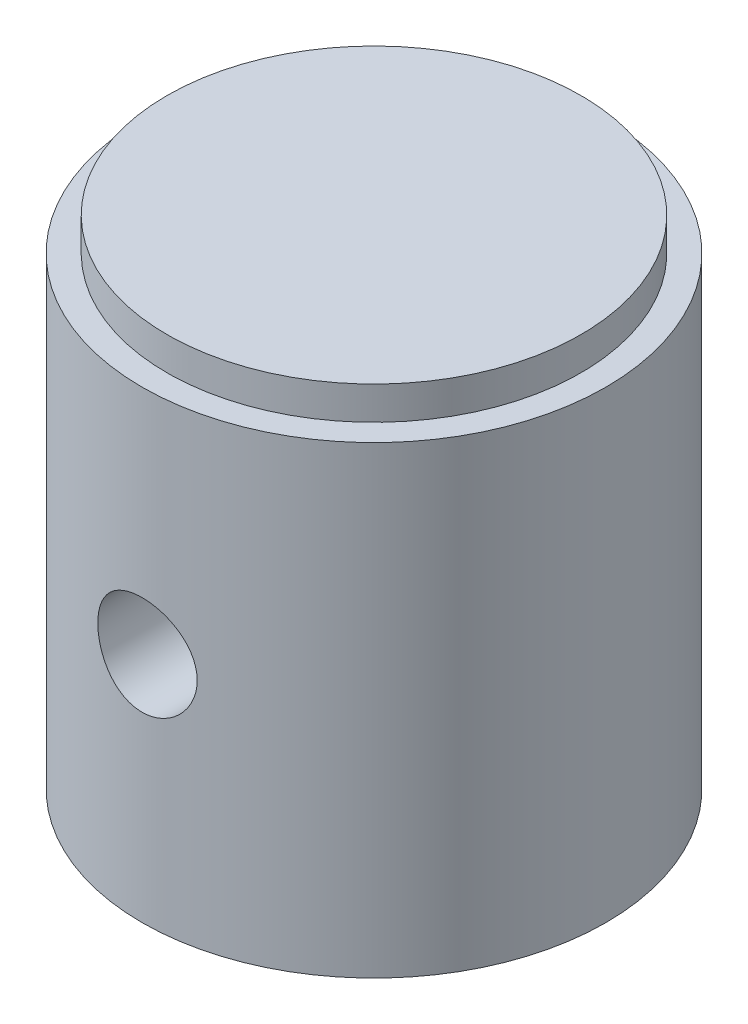
ISO-10303-21;
HEADER;
FILE_DESCRIPTION(('STEP AP214'),'2;1');
FILE_NAME('part.step','',(''),(''),'','','');
FILE_SCHEMA(('AUTOMOTIVE_DESIGN { 1 0 10303 214 1 1 1 1 }'));
ENDSEC;
DATA;
#1=APPLICATION_CONTEXT('core data for automotive mechanical design processes');
#2=APPLICATION_PROTOCOL_DEFINITION('international standard','automotive_design',2000,#1);
#3=PRODUCT_CONTEXT('',#1,'mechanical');
#4=PRODUCT('Part','Part','',(#3));
#5=PRODUCT_RELATED_PRODUCT_CATEGORY('part','',(#4));
#6=PRODUCT_DEFINITION_FORMATION('','',#4);
#7=PRODUCT_DEFINITION_CONTEXT('part definition',#1,'design');
#8=PRODUCT_DEFINITION('design','',#6,#7);
#9=PRODUCT_DEFINITION_SHAPE('','',#8);
#10=(LENGTH_UNIT() NAMED_UNIT(*) SI_UNIT(.MILLI.,.METRE.));
#11=(NAMED_UNIT(*) PLANE_ANGLE_UNIT() SI_UNIT($,.RADIAN.));
#12=(NAMED_UNIT(*) SI_UNIT($,.STERADIAN.) SOLID_ANGLE_UNIT());
#13=UNCERTAINTY_MEASURE_WITH_UNIT(LENGTH_MEASURE(1.E-05),#10,'distance_accuracy_value','');
#14=(GEOMETRIC_REPRESENTATION_CONTEXT(3) GLOBAL_UNCERTAINTY_ASSIGNED_CONTEXT((#13)) GLOBAL_UNIT_ASSIGNED_CONTEXT((#10,
#11,#12)) REPRESENTATION_CONTEXT('',''));
#15=CARTESIAN_POINT('',(0.,0.,0.));
#16=DIRECTION('',(0.,0.,1.));
#17=DIRECTION('',(1.,0.,0.));
#18=AXIS2_PLACEMENT_3D('',#15,#16,#17);
#19=CARTESIAN_POINT('',(0.,1.1459120596191,0.));
#20=DIRECTION('',(0.,1.,0.));
#21=DIRECTION('',(-1.,0.,0.));
#22=AXIS2_PLACEMENT_3D('',#19,#20,#21);
#23=PLANE('',#22);
#24=CARTESIAN_POINT('',(0.,1.1459120596191,0.));
#25=DIRECTION('',(0.,1.,0.));
#26=DIRECTION('',(-1.,0.,0.));
#27=AXIS2_PLACEMENT_3D('',#24,#25,#26);
#28=CIRCLE('',#27,6.25);
#29=CARTESIAN_POINT('',(-6.25,1.1459120596191,0.));
#30=VERTEX_POINT('',#29);
#31=EDGE_CURVE('E11',#30,#30,#28,.T.);
#32=ORIENTED_EDGE('',*,*,#31,.T.);
#33=EDGE_LOOP('',(#32));
#34=FACE_BOUND('',#33,.T.);
#35=ADVANCED_FACE('F39',(#34),#23,.T.);
#36=CARTESIAN_POINT('',(0.,1.1459120596191,0.));
#37=DIRECTION('',(0.,1.,0.));
#38=DIRECTION('',(-1.,0.,0.));
#39=AXIS2_PLACEMENT_3D('',#36,#37,#38);
#40=CYLINDRICAL_SURFACE('',#39,6.25);
#41=CARTESIAN_POINT('',(0.,0.145912059619102,0.));
#42=DIRECTION('',(0.,1.,0.));
#43=DIRECTION('',(-1.,0.,0.));
#44=AXIS2_PLACEMENT_3D('',#41,#42,#43);
#45=CIRCLE('',#44,6.25);
#46=CARTESIAN_POINT('',(-6.25,0.145912059619103,0.));
#47=VERTEX_POINT('',#46);
#48=EDGE_CURVE('E52',#47,#47,#45,.T.);
#49=ORIENTED_EDGE('',*,*,#48,.T.);
#50=EDGE_LOOP('',(#49));
#51=FACE_BOUND('',#50,.T.);
#52=ORIENTED_EDGE('',*,*,#31,.F.);
#53=EDGE_LOOP('',(#52));
#54=FACE_BOUND('',#53,.T.);
#55=ADVANCED_FACE('F127',(#51,#54),#40,.T.);
#56=CARTESIAN_POINT('',(-6.25,0.145912059619103,0.));
#57=DIRECTION('',(0.,1.,0.));
#58=DIRECTION('',(-1.,0.,0.));
#59=AXIS2_PLACEMENT_3D('',#56,#57,#58);
#60=PLANE('',#59);
#61=CARTESIAN_POINT('',(0.,0.145912059619102,0.));
#62=DIRECTION('',(0.,1.,0.));
#63=DIRECTION('',(-1.,0.,0.));
#64=AXIS2_PLACEMENT_3D('',#61,#62,#63);
#65=CIRCLE('',#64,7.);
#66=CARTESIAN_POINT('',(-7.,0.145912059619103,0.));
#67=VERTEX_POINT('',#66);
#68=EDGE_CURVE('E91',#67,#67,#65,.T.);
#69=ORIENTED_EDGE('',*,*,#68,.T.);
#70=EDGE_LOOP('',(#69));
#71=FACE_BOUND('',#70,.T.);
#72=ORIENTED_EDGE('',*,*,#48,.F.);
#73=EDGE_LOOP('',(#72));
#74=FACE_BOUND('',#73,.T.);
#75=ADVANCED_FACE('F123',(#71,#74),#60,.T.);
#76=CARTESIAN_POINT('',(0.,1.1459120596191,0.));
#77=DIRECTION('',(0.,1.,0.));
#78=DIRECTION('',(-1.,0.,0.));
#79=AXIS2_PLACEMENT_3D('',#76,#77,#78);
#80=CYLINDRICAL_SURFACE('',#79,7.);
#81=CARTESIAN_POINT('',(0.,-5.35408794038089,-7.));
#82=CARTESIAN_POINT('',(0.083235886090617,-5.3540908399552,-6.99999846043226));
#83=CARTESIAN_POINT('',(0.166507195600275,-5.36103954876875,-6.9985002594971));
#84=CARTESIAN_POINT('',(0.330687344293328,-5.38862359723449,-6.99266829827727));
#85=CARTESIAN_POINT('',(0.411594403571191,-5.40926898457583,-6.98833245637099));
#86=CARTESIAN_POINT('',(0.568649323817737,-5.46357230498893,-6.97730831788826));
#87=CARTESIAN_POINT('',(0.644801963446556,-5.49721691976221,-6.97062242967171));
#88=CARTESIAN_POINT('',(0.790378177960787,-5.57652202655216,-6.95562106817971));
#89=CARTESIAN_POINT('',(0.85980198174737,-5.62218210963084,-6.9473056503666));
#90=CARTESIAN_POINT('',(0.99102479053523,-5.7249682400544,-6.92981369246311));
#91=CARTESIAN_POINT('',(1.05270503419445,-5.78224416227942,-6.92062683143259));
#92=CARTESIAN_POINT('',(1.16566042389435,-5.90631425606609,-6.90250069814144));
#93=CARTESIAN_POINT('',(1.21693467150908,-5.97310924863215,-6.8935614473163));
#94=CARTESIAN_POINT('',(1.30814204379809,-6.11519369324133,-6.87684116047225));
#95=CARTESIAN_POINT('',(1.34794958335009,-6.19056545813711,-6.8690733634436));
#96=CARTESIAN_POINT('',(1.41428823691148,-6.34712239414773,-6.85572325558537));
#97=CARTESIAN_POINT('',(1.44082087001716,-6.42830689887347,-6.85014069470711));
#98=CARTESIAN_POINT('',(1.47946574422454,-6.59289902696897,-6.8418980892631));
#99=CARTESIAN_POINT('',(1.49178779748342,-6.67625521604476,-6.83919556896486));
#100=CARTESIAN_POINT('',(1.50231395206577,-6.84389217288789,-6.83689139845106));
#101=CARTESIAN_POINT('',(1.50051971664629,-6.92817283056084,-6.83728938291729));
#102=CARTESIAN_POINT('',(1.48303326340861,-7.09371262831469,-6.84110276603832));
#103=CARTESIAN_POINT('',(1.46758398649408,-7.17499882948105,-6.84446541682162));
#104=CARTESIAN_POINT('',(1.42361054298677,-7.33379818067024,-6.85374593375788));
#105=CARTESIAN_POINT('',(1.39508566936466,-7.41131112641322,-6.85966393808402));
#106=CARTESIAN_POINT('',(1.32554551075991,-7.56105081325423,-6.87344080755724));
#107=CARTESIAN_POINT('',(1.2844361097283,-7.63323245309345,-6.88131420983365));
#108=CARTESIAN_POINT('',(1.19096007283993,-7.76976310533885,-6.89810572501288));
#109=CARTESIAN_POINT('',(1.13859196103562,-7.8341110890671,-6.90702397481896));
#110=CARTESIAN_POINT('',(1.0227954275532,-7.95454729605429,-6.92512718393878));
#111=CARTESIAN_POINT('',(0.959160233964409,-8.01043664696564,-6.93431383972178));
#112=CARTESIAN_POINT('',(0.823317306269096,-8.11078167407056,-6.95175017497059));
#113=CARTESIAN_POINT('',(0.751109428775399,-8.15523715898129,-6.95999983875972));
#114=CARTESIAN_POINT('',(0.599933462049959,-8.23149862028782,-6.97465778534003));
#115=CARTESIAN_POINT('',(0.520952258863482,-8.26327935295888,-6.98106238643354));
#116=CARTESIAN_POINT('',(0.358603146685706,-8.31306358870198,-6.99128109245334));
#117=CARTESIAN_POINT('',(0.275235851133668,-8.33106901294421,-6.99509555860384));
#118=CARTESIAN_POINT('',(0.108187670836628,-8.35250415452432,-6.99965306347808));
#119=CARTESIAN_POINT('',(0.0245431772716141,-8.35620565326268,-7.00045336521066));
#120=CARTESIAN_POINT('',(-0.142168973650405,-8.34966336925573,-6.99905248935969));
#121=CARTESIAN_POINT('',(-0.225236668127255,-8.33942049241795,-6.99685150675698));
#122=CARTESIAN_POINT('',(-0.387542537982806,-8.30550569671919,-6.98973143045266));
#123=CARTESIAN_POINT('',(-0.466811712908477,-8.28197557090836,-6.98484105045459));
#124=CARTESIAN_POINT('',(-0.620278450473418,-8.22231099738607,-6.9728892442151));
#125=CARTESIAN_POINT('',(-0.69447559258774,-8.18617550606924,-6.96582763822237));
#126=CARTESIAN_POINT('',(-0.836821397964754,-8.10175439732057,-6.950175043904));
#127=CARTESIAN_POINT('',(-0.90487257511114,-8.05330814547117,-6.94156431354275));
#128=CARTESIAN_POINT('',(-1.0319769255236,-7.94585311549216,-6.92381033034847));
#129=CARTESIAN_POINT('',(-1.091028978692,-7.88684302449345,-6.91466701142097));
#130=CARTESIAN_POINT('',(-1.19952711057989,-7.75869057019376,-6.89668172706324));
#131=CARTESIAN_POINT('',(-1.24878537255156,-7.68938784115879,-6.88784792221285));
#132=CARTESIAN_POINT('',(-1.3349641538604,-7.5433333439029,-6.87166654559681));
#133=CARTESIAN_POINT('',(-1.37188519913706,-7.4665818934034,-6.86431891048055));
#134=CARTESIAN_POINT('',(-1.43209741248548,-7.30821564138629,-6.8520100980739));
#135=CARTESIAN_POINT('',(-1.45546398641275,-7.22663058395023,-6.84703574582967));
#136=CARTESIAN_POINT('',(-1.48812696085335,-7.06057235654726,-6.84001186708418));
#137=CARTESIAN_POINT('',(-1.49742550780258,-6.97609962917957,-6.83796189439706));
#138=CARTESIAN_POINT('',(-1.5015999992604,-6.80855559720565,-6.83704618848155));
#139=CARTESIAN_POINT('',(-1.49677347258311,-6.72549192540032,-6.83811476518543));
#140=CARTESIAN_POINT('',(-1.47349789406331,-6.56139069824831,-6.8431676318483));
#141=CARTESIAN_POINT('',(-1.45504898957979,-6.48035312099432,-6.84715189026714));
#142=CARTESIAN_POINT('',(-1.40519345940434,-6.32282928251173,-6.85755581104157));
#143=CARTESIAN_POINT('',(-1.37382847170887,-6.2463292917166,-6.86396764224703));
#144=CARTESIAN_POINT('',(-1.29906751595601,-6.09963256787405,-6.87850764590649));
#145=CARTESIAN_POINT('',(-1.255670353015,-6.02943646176585,-6.88663598880363));
#146=CARTESIAN_POINT('',(-1.15708290349304,-5.89586974665553,-6.90389055593232));
#147=CARTESIAN_POINT('',(-1.10167987421237,-5.83265824443392,-6.91303309938926));
#148=CARTESIAN_POINT('',(-0.98108655461962,-5.71633167786044,-6.93117449799694));
#149=CARTESIAN_POINT('',(-0.915894009385597,-5.66321894606869,-6.94017331951296));
#150=CARTESIAN_POINT('',(-0.776603147268716,-5.56797198087533,-6.95714491048987));
#151=CARTESIAN_POINT('',(-0.702404846009641,-5.52598133414992,-6.96510364570626));
#152=CARTESIAN_POINT('',(-0.547850160940597,-5.45513341147471,-6.97895826104019));
#153=CARTESIAN_POINT('',(-0.467499105863879,-5.42626491779586,-6.98485590212343));
#154=CARTESIAN_POINT('',(-0.322535217553204,-5.38773575524975,-6.99284848461772));
#155=CARTESIAN_POINT('',(-0.258717205545979,-5.37514150640086,-6.99551391888263));
#156=CARTESIAN_POINT('',(-0.129939960853847,-5.35831663866923,-6.99909024154719));
#157=CARTESIAN_POINT('',(-0.0649807750887449,-5.35408567673484,-7.00000120191314));
#158=CARTESIAN_POINT('',(0.,-5.35408794038089,-7.));
#159=B_SPLINE_CURVE_WITH_KNOTS('',3,(#81,#82,#83,#84,#85,#86,#87,#88,#89,#90,#91,#92,#93,#94,
#95,#96,#97,#98,#99,#100,#101,#102,#103,#104,#105,#106,#107,#108,#109,#110,#111,#112,#113,#114,
#115,#116,#117,#118,#119,#120,#121,#122,#123,#124,#125,#126,#127,#128,#129,#130,#131,#132,#133,
#134,#135,#136,#137,#138,#139,#140,#141,#142,#143,#144,#145,#146,#147,#148,#149,#150,#151,#152,
#153,#154,#155,#156,#157,#158),.UNSPECIFIED.,.T.,.F.,(4,2,2,2,2,2,2,2,2,2,2,2,2,2,2,2,2,2,2,2,2,
2,2,2,2,2,2,2,2,2,2,2,2,2,2,2,2,2,4),(0.,0.249469836512082,0.499122883219936,0.748520824425602,
0.997910278645886,1.25074961881732,1.50361077918506,1.7591442921451,2.0146485567749,
2.26633008124666,2.51798195169165,2.76524475452927,3.01252092904568,3.26169356165968,
3.51089887920889,3.76527011050291,4.0196455970235,4.27452521139806,4.52936927256343,
4.77934665704185,5.02930780231429,5.27665060589267,5.52401389198434,5.77478733867803,
6.02559197304485,6.28082063283534,6.53603841075806,6.78982240408475,7.04356767229185,
7.29200680540294,7.5404432510827,7.78808499706785,8.03575134451623,8.28822950154114,
8.54076590397115,8.79641910357222,9.05185334010271,9.24661799132293,9.44137465337336),.UNSPECIFIED.);
#160=CARTESIAN_POINT('',(0.,-5.35408794038089,-7.));
#161=VERTEX_POINT('',#160);
#162=EDGE_CURVE('E68',#161,#161,#159,.T.);
#163=ORIENTED_EDGE('',*,*,#162,.F.);
#164=EDGE_LOOP('',(#163));
#165=FACE_BOUND('',#164,.T.);
#166=CARTESIAN_POINT('',(1.5,-6.8540879403809,6.83739716558867));
#167=CARTESIAN_POINT('',(1.49999708238613,-6.77087678789895,6.83739884558951));
#168=CARTESIAN_POINT('',(1.49305236244768,-6.68763016643878,6.83893272341929));
#169=CARTESIAN_POINT('',(1.46548559252999,-6.52350126813889,6.84489178429867));
#170=CARTESIAN_POINT('',(1.44485339653622,-6.44262079170469,6.84931911211841));
#171=CARTESIAN_POINT('',(1.39058863684599,-6.28562219080669,6.86054115293409));
#172=CARTESIAN_POINT('',(1.35697000991314,-6.20949906225943,6.86733332725825));
#173=CARTESIAN_POINT('',(1.27772617673341,-6.06397266643629,6.88251670848644));
#174=CARTESIAN_POINT('',(1.23210132048776,-5.99456920335182,6.89090786877545));
#175=CARTESIAN_POINT('',(1.12935142570221,-5.86332497889877,6.90849578796654));
#176=CARTESIAN_POINT('',(1.07206859483983,-5.80160906414093,6.91770249871753));
#177=CARTESIAN_POINT('',(0.947969508129576,-5.68858438597511,6.93579691710397));
#178=CARTESIAN_POINT('',(0.881152530217675,-5.63727641152083,6.94468460051416));
#179=CARTESIAN_POINT('',(0.739047288464581,-5.54603249588946,6.96124769109432));
#180=CARTESIAN_POINT('',(0.663680488229952,-5.50621628461028,6.96890998819429));
#181=CARTESIAN_POINT('',(0.507134269342594,-5.4398602489346,6.98204671042934));
#182=CARTESIAN_POINT('',(0.425955477380311,-5.41331899559462,6.98752137103329));
#183=CARTESIAN_POINT('',(0.261387187671511,-5.37465796944956,6.9955956528118));
#184=CARTESIAN_POINT('',(0.178049400596923,-5.36232701182847,6.99823733378385));
#185=CARTESIAN_POINT('',(0.010448945306644,-5.35177666306764,7.00049362207002));
#186=CARTESIAN_POINT('',(-0.0738136201647599,-5.35355571982014,7.00010856232698));
#187=CARTESIAN_POINT('',(-0.239417029250512,-5.37101690504448,6.99638700862558));
#188=CARTESIAN_POINT('',(-0.320783115362113,-5.38647144067082,6.99309883152431));
#189=CARTESIAN_POINT('',(-0.479739463978389,-5.43048262223276,6.98399541589104));
#190=CARTESIAN_POINT('',(-0.557329560175055,-5.45903984468064,6.97818006616518));
#191=CARTESIAN_POINT('',(-0.707167497556553,-5.52864939926942,6.96459754646858));
#192=CARTESIAN_POINT('',(-0.779373657015789,-5.56978870758524,6.95681685803946));
#193=CARTESIAN_POINT('',(-0.915940926562847,-5.66332990854449,6.94015793743865));
#194=CARTESIAN_POINT('',(-0.980301006451529,-5.7157332776812,6.93127956144693));
#195=CARTESIAN_POINT('',(-1.10070208800198,-5.83155648490876,6.91319326460925));
#196=CARTESIAN_POINT('',(-1.15655117320251,-5.89517551973793,6.90398230372853));
#197=CARTESIAN_POINT('',(-1.25682243234728,-6.0309712254494,6.88643566831974));
#198=CARTESIAN_POINT('',(-1.30124432118068,-6.10314810978615,6.87810001563386));
#199=CARTESIAN_POINT('',(-1.37748077573296,-6.25431244144466,6.86324023586723));
#200=CARTESIAN_POINT('',(-1.40926035088923,-6.33331806423334,6.85672115127775));
#201=CARTESIAN_POINT('',(-1.45903495159116,-6.49572070632733,6.84630340806616));
#202=CARTESIAN_POINT('',(-1.47703206694628,-6.57911705782409,6.84240435218483));
#203=CARTESIAN_POINT('',(-1.49843586024652,-6.74618369303061,6.83774881255446));
#204=CARTESIAN_POINT('',(-1.5021214192864,-6.8298166154582,6.83693227051701));
#205=CARTESIAN_POINT('',(-1.49555139642373,-6.99650193356259,6.83837239573993));
#206=CARTESIAN_POINT('',(-1.48529673081635,-7.07955436703445,6.84062886101063));
#207=CARTESIAN_POINT('',(-1.45137894635584,-7.24175837536166,6.84790415484205));
#208=CARTESIAN_POINT('',(-1.42786830251553,-7.32094337297786,6.85289155274364));
#209=CARTESIAN_POINT('',(-1.36827052946749,-7.47425027791382,6.86503859869777));
#210=CARTESIAN_POINT('',(-1.33218223662818,-7.54837171601509,6.87219844772849));
#211=CARTESIAN_POINT('',(-1.24783504416705,-7.69065762513981,6.88801634080345));
#212=CARTESIAN_POINT('',(-1.19940368590792,-7.75871752239308,6.89669501746317));
#213=CARTESIAN_POINT('',(-1.09197183833601,-7.88584628625469,6.91451775360139));
#214=CARTESIAN_POINT('',(-1.03297009182161,-7.94491408182936,6.92366186834461));
#215=CARTESIAN_POINT('',(-0.904812764420814,-8.05345824332565,6.94158239990173));
#216=CARTESIAN_POINT('',(-0.835494925828771,-8.10274485653791,6.95034935607746));
#217=CARTESIAN_POINT('',(-0.689401481282276,-8.18897334973194,6.96635610714901));
#218=CARTESIAN_POINT('',(-0.61262621604374,-8.22591579335373,6.97359597176692));
#219=CARTESIAN_POINT('',(-0.454265418982041,-8.28613999501937,6.98569278381574));
#220=CARTESIAN_POINT('',(-0.372713193075172,-8.30950624412717,6.99056443803698));
#221=CARTESIAN_POINT('',(-0.206725177003289,-8.34217964611321,6.9974393930198));
#222=CARTESIAN_POINT('',(-0.122289789973993,-8.35148875635481,6.99944309312296));
#223=CARTESIAN_POINT('',(0.045263717052829,-8.35569859279275,7.00034511009056));
#224=CARTESIAN_POINT('',(0.128374505509229,-8.35088309898552,6.99930459001667));
#225=CARTESIAN_POINT('',(0.29257293841596,-8.32761317686187,6.99436552363383));
#226=CARTESIAN_POINT('',(0.373660616405285,-8.30915897480258,6.99046702473686));
#227=CARTESIAN_POINT('',(0.53130194848727,-8.2592691341314,6.98025388638537));
#228=CARTESIAN_POINT('',(0.607868365073177,-8.22787225099534,6.97394646430492));
#229=CARTESIAN_POINT('',(0.75468495672322,-8.15302666921177,6.9595903605066));
#230=CARTESIAN_POINT('',(0.824934544796141,-8.10957685207487,6.9515415172034));
#231=CARTESIAN_POINT('',(0.958512306895243,-8.01092562163822,6.93439809934493));
#232=CARTESIAN_POINT('',(1.02169036510577,-7.95552378205958,6.92528708907874));
#233=CARTESIAN_POINT('',(1.13795001457643,-7.83494733013055,6.90713690075836));
#234=CARTESIAN_POINT('',(1.19102918062422,-7.76977037702529,6.89809774045682));
#235=CARTESIAN_POINT('',(1.28623261596675,-7.63049744719522,6.88098693651915));
#236=CARTESIAN_POINT('',(1.32820897809616,-7.55629858209387,6.87292905956533));
#237=CARTESIAN_POINT('',(1.39903004659825,-7.40174421945765,6.85886497228049));
#238=CARTESIAN_POINT('',(1.42788606423931,-7.32139409512783,6.85285699581573));
#239=CARTESIAN_POINT('',(1.46638607121557,-7.17646180919503,6.84470560641996));
#240=CARTESIAN_POINT('',(1.47896752507743,-7.11267626467307,6.84198283087953));
#241=CARTESIAN_POINT('',(1.49577544043437,-6.98396362880358,6.83832799504406));
#242=CARTESIAN_POINT('',(1.50000227727981,-6.91903658887258,6.83739585430069));
#243=CARTESIAN_POINT('',(1.5,-6.8540879403809,6.83739716558867));
#244=B_SPLINE_CURVE_WITH_KNOTS('',3,(#166,#167,#168,#169,#170,#171,#172,#173,#174,#175,#176,
#177,#178,#179,#180,#181,#182,#183,#184,#185,#186,#187,#188,#189,#190,#191,#192,#193,#194,#195,
#196,#197,#198,#199,#200,#201,#202,#203,#204,#205,#206,#207,#208,#209,#210,#211,#212,#213,#214,
#215,#216,#217,#218,#219,#220,#221,#222,#223,#224,#225,#226,#227,#228,#229,#230,#231,#232,#233,
#234,#235,#236,#237,#238,#239,#240,#241,#242,#243),.UNSPECIFIED.,.T.,.F.,(4,2,2,2,2,2,2,2,2,2,2,
2,2,2,2,2,2,2,2,2,2,2,2,2,2,2,2,2,2,2,2,2,2,2,2,2,2,2,4),(0.,0.249395482027528,
0.498976038479964,0.748289491152759,0.997595676735283,1.25053229582692,1.50348808112879,
1.75899134820278,2.01446710646268,2.26609508151929,2.51769537777241,2.76518557667372,
3.01268666607584,3.26193888143437,3.51122378872315,3.76548960779295,4.01976177023092,
4.27473287411781,4.52966530953839,4.77960433192523,5.02952692653917,5.27663180749375,
5.5237595556315,5.77455010216318,6.02537049659078,6.2806621468321,6.53594213875541,
6.78961589824375,7.04325433208539,7.29183199644127,7.540405537151,7.78824009619483,
8.03609766151365,8.28848914160965,8.54094115631232,8.79660380167249,9.05204561611687,
9.24671456122272,9.44137476018022),.UNSPECIFIED.);
#245=CARTESIAN_POINT('',(1.5,-6.8540879403809,6.83739716558867));
#246=VERTEX_POINT('',#245);
#247=EDGE_CURVE('E76',#246,#246,#244,.T.);
#248=ORIENTED_EDGE('',*,*,#247,.F.);
#249=EDGE_LOOP('',(#248));
#250=FACE_BOUND('',#249,.T.);
#251=CARTESIAN_POINT('',(0.,-13.8540879403809,0.));
#252=DIRECTION('',(0.,1.,0.));
#253=DIRECTION('',(-1.,0.,0.));
#254=AXIS2_PLACEMENT_3D('',#251,#252,#253);
#255=CIRCLE('',#254,7.);
#256=CARTESIAN_POINT('',(-7.,-13.8540879403809,0.));
#257=VERTEX_POINT('',#256);
#258=EDGE_CURVE('E87',#257,#257,#255,.T.);
#259=ORIENTED_EDGE('',*,*,#258,.T.);
#260=EDGE_LOOP('',(#259));
#261=FACE_BOUND('',#260,.T.);
#262=ORIENTED_EDGE('',*,*,#68,.F.);
#263=EDGE_LOOP('',(#262));
#264=FACE_BOUND('',#263,.T.);
#265=ADVANCED_FACE('F117',(#165,#250,#261,#264),#80,.T.);
#266=CARTESIAN_POINT('',(-7.,-13.8540879403809,0.));
#267=DIRECTION('',(0.,-1.,0.));
#268=DIRECTION('',(1.,0.,0.));
#269=AXIS2_PLACEMENT_3D('',#266,#267,#268);
#270=PLANE('',#269);
#271=CARTESIAN_POINT('',(0.,-13.8540879403809,0.));
#272=DIRECTION('',(0.,1.,0.));
#273=DIRECTION('',(-1.,0.,0.));
#274=AXIS2_PLACEMENT_3D('',#271,#272,#273);
#275=CIRCLE('',#274,6.25);
#276=CARTESIAN_POINT('',(-6.25,-13.8540879403809,0.));
#277=VERTEX_POINT('',#276);
#278=EDGE_CURVE('E73',#277,#277,#275,.T.);
#279=ORIENTED_EDGE('',*,*,#278,.T.);
#280=EDGE_LOOP('',(#279));
#281=FACE_BOUND('',#280,.T.);
#282=ORIENTED_EDGE('',*,*,#258,.F.);
#283=EDGE_LOOP('',(#282));
#284=FACE_BOUND('',#283,.T.);
#285=ADVANCED_FACE('F122',(#281,#284),#270,.T.);
#286=CARTESIAN_POINT('',(0.,-13.8540879403809,0.));
#287=DIRECTION('',(0.,-1.,0.));
#288=DIRECTION('',(1.,0.,0.));
#289=AXIS2_PLACEMENT_3D('',#286,#287,#288);
#290=CONICAL_SURFACE('',#289,6.25,0.349065850398867);
#291=CARTESIAN_POINT('',(0.,-9.73287181119897,0.));
#292=DIRECTION('',(0.,1.,0.));
#293=DIRECTION('',(-1.,0.,0.));
#294=AXIS2_PLACEMENT_3D('',#291,#292,#293);
#295=CIRCLE('',#294,4.75);
#296=CARTESIAN_POINT('',(-4.75,-9.73287181119897,0.));
#297=VERTEX_POINT('',#296);
#298=EDGE_CURVE('E67',#297,#297,#295,.T.);
#299=ORIENTED_EDGE('',*,*,#298,.T.);
#300=EDGE_LOOP('',(#299));
#301=FACE_BOUND('',#300,.T.);
#302=ORIENTED_EDGE('',*,*,#278,.F.);
#303=EDGE_LOOP('',(#302));
#304=FACE_BOUND('',#303,.T.);
#305=ADVANCED_FACE('F161',(#301,#304),#290,.F.);
#306=CARTESIAN_POINT('',(0.,1.1459120596191,0.));
#307=DIRECTION('',(0.,1.,0.));
#308=DIRECTION('',(-1.,0.,0.));
#309=AXIS2_PLACEMENT_3D('',#306,#307,#308);
#310=CYLINDRICAL_SURFACE('',#309,4.75);
#311=CARTESIAN_POINT('',(1.5,-6.8540879403809,-4.50693909432998));
#312=CARTESIAN_POINT('',(1.49999958004515,-6.77211965770475,-4.50693949515468));
#313=CARTESIAN_POINT('',(1.49325840231682,-6.69014695665615,-4.50919970874085));
#314=CARTESIAN_POINT('',(1.46655104887094,-6.52861293088145,-4.5179553253781));
#315=CARTESIAN_POINT('',(1.44658152131253,-6.44905222265821,-4.52445180182027));
#316=CARTESIAN_POINT('',(1.39417508352591,-6.29470573753136,-4.54087234787262));
#317=CARTESIAN_POINT('',(1.36176059537411,-6.21991165356938,-4.55079024986066));
#318=CARTESIAN_POINT('',(1.28545946652237,-6.07680188437625,-4.57292751994247));
#319=CARTESIAN_POINT('',(1.24157071835092,-6.00848739239293,-4.58514731070763));
#320=CARTESIAN_POINT('',(1.14191784971278,-5.87787926892884,-4.6109923380212));
#321=CARTESIAN_POINT('',(1.08582030493755,-5.81584637664498,-4.62464992232587));
#322=CARTESIAN_POINT('',(0.964055421977067,-5.70189358755739,-4.65155671093151));
#323=CARTESIAN_POINT('',(0.89838672023377,-5.64997513417725,-4.66480585671777));
#324=CARTESIAN_POINT('',(0.757464836701734,-5.55656943425551,-4.68977365915903));
#325=CARTESIAN_POINT('',(0.682025001056138,-5.51535142867754,-4.70144979545653));
#326=CARTESIAN_POINT('',(0.524852067423558,-5.44629068315632,-4.72157773016224));
#327=CARTESIAN_POINT('',(0.443120487221092,-5.41844472907475,-4.73003030329318));
#328=CARTESIAN_POINT('',(0.278414775826808,-5.37779120927978,-4.74252974850081));
#329=CARTESIAN_POINT('',(0.195560751143445,-5.36453783892484,-4.74670693307633));
#330=CARTESIAN_POINT('',(0.0287067286102971,-5.35203243628333,-4.75064554540297));
#331=CARTESIAN_POINT('',(-0.0552929988694202,-5.35277715587082,-4.75040799755164));
#332=CARTESIAN_POINT('',(-0.218913619351864,-5.36795513993678,-4.74563427350171));
#333=CARTESIAN_POINT('',(-0.298584494979865,-5.38190499009775,-4.74124990899214));
#334=CARTESIAN_POINT('',(-0.454390311754809,-5.42230309803132,-4.72886249486103));
#335=CARTESIAN_POINT('',(-0.530525020335841,-5.44875217657589,-4.72085920760149));
#336=CARTESIAN_POINT('',(-0.678203652675078,-5.51370412226572,-4.7019310355991));
#337=CARTESIAN_POINT('',(-0.74967901329581,-5.55235226805687,-4.69097118266662));
#338=CARTESIAN_POINT('',(-0.885279102378908,-5.64048825496804,-4.66728249867119));
#339=CARTESIAN_POINT('',(-0.949401935733848,-5.68997888120315,-4.65455321340063));
#340=CARTESIAN_POINT('',(-1.07135837440922,-5.80086990661582,-4.62803989727125));
#341=CARTESIAN_POINT('',(-1.12880871974839,-5.86268717443348,-4.61423403233704));
#342=CARTESIAN_POINT('',(-1.23264301054731,-5.99520609936004,-4.58758892442481));
#343=CARTESIAN_POINT('',(-1.2790255944206,-6.06590884795349,-4.57474980051078));
#344=CARTESIAN_POINT('',(-1.35986638692084,-6.21529471221214,-4.55138024059369));
#345=CARTESIAN_POINT('',(-1.39417963639867,-6.29406107899699,-4.54087839223384));
#346=CARTESIAN_POINT('',(-1.44893342452635,-6.45666604209651,-4.5237069894911));
#347=CARTESIAN_POINT('',(-1.46937907304313,-6.54050275769753,-4.5170360236621));
#348=CARTESIAN_POINT('',(-1.49507161979024,-6.70719030070481,-4.5085959379324));
#349=CARTESIAN_POINT('',(-1.50090655288536,-6.78994094405966,-4.50663729609298));
#350=CARTESIAN_POINT('',(-1.49886513965521,-6.95524565634738,-4.50731687465407));
#351=CARTESIAN_POINT('',(-1.49099096720734,-7.03779975436817,-4.50995436623754));
#352=CARTESIAN_POINT('',(-1.46228084598242,-7.19781462827836,-4.51934163323601));
#353=CARTESIAN_POINT('',(-1.4418371919129,-7.27535386104785,-4.5259668251803));
#354=CARTESIAN_POINT('',(-1.38903056686353,-7.42589187285971,-4.54245022183902));
#355=CARTESIAN_POINT('',(-1.35666562487664,-7.49888989874712,-4.55230896114271));
#356=CARTESIAN_POINT('',(-1.2798587413425,-7.64062964410241,-4.57450539166733));
#357=CARTESIAN_POINT('',(-1.2350921421442,-7.70918516865475,-4.58690698850856));
#358=CARTESIAN_POINT('',(-1.13512998682984,-7.83802498613947,-4.61266077618539));
#359=CARTESIAN_POINT('',(-1.07993166463934,-7.8983070779543,-4.62601321856053));
#360=CARTESIAN_POINT('',(-0.957886037531119,-8.01152971698889,-4.65285013455169));
#361=CARTESIAN_POINT('',(-0.890643665109767,-8.06404992326931,-4.66631614662306));
#362=CARTESIAN_POINT('',(-0.747973360630615,-8.15707924857223,-4.6912975579683));
#363=CARTESIAN_POINT('',(-0.672545793179843,-8.19758890230138,-4.70281304406929));
#364=CARTESIAN_POINT('',(-0.516099288450846,-8.26506030291253,-4.72253168708172));
#365=CARTESIAN_POINT('',(-0.435125281433141,-8.29211897216542,-4.73075845435933));
#366=CARTESIAN_POINT('',(-0.269469399491867,-8.33214098472389,-4.7430763734001));
#367=CARTESIAN_POINT('',(-0.184788721002361,-8.34510884184614,-4.74716884950256));
#368=CARTESIAN_POINT('',(-0.0179886485878242,-8.35620824364676,-4.7506674317259));
#369=CARTESIAN_POINT('',(0.0640868361538648,-8.35494634309592,-4.75026513795577));
#370=CARTESIAN_POINT('',(0.226803220963033,-8.33909339504485,-4.74528029002945));
#371=CARTESIAN_POINT('',(0.307444217580877,-8.32450324810918,-4.74069801830655));
#372=CARTESIAN_POINT('',(0.463969836764499,-8.28279688043801,-4.72793024704182));
#373=CARTESIAN_POINT('',(0.539902672774311,-8.2558460076333,-4.71979237633648));
#374=CARTESIAN_POINT('',(0.686204345183072,-8.19033308378628,-4.70075227796056));
#375=CARTESIAN_POINT('',(0.756572215112847,-8.15176902144504,-4.68984957149724));
#376=CARTESIAN_POINT('',(0.892382156713933,-8.06259062090742,-4.66594837362514));
#377=CARTESIAN_POINT('',(0.957571386267192,-8.01160726897524,-4.65289067194133));
#378=CARTESIAN_POINT('',(1.07867009763973,-7.89968472788244,-4.62631837968684));
#379=CARTESIAN_POINT('',(1.13457676425287,-7.83874252949149,-4.61280365200012));
#380=CARTESIAN_POINT('',(1.23744612372159,-7.70614649760876,-4.58630016066439));
#381=CARTESIAN_POINT('',(1.28403955823579,-7.63419864212283,-4.5733449634976));
#382=CARTESIAN_POINT('',(1.36442560849337,-7.48310188366023,-4.55001145096037));
#383=CARTESIAN_POINT('',(1.39822313048984,-7.40395575513588,-4.5396321484584));
#384=CARTESIAN_POINT('',(1.44974900503547,-7.24714148780966,-4.52342799882925));
#385=CARTESIAN_POINT('',(1.46853682069789,-7.16985149452299,-4.51730787458817));
#386=CARTESIAN_POINT('',(1.4936609032698,-7.01307131452832,-4.50906374742014));
#387=CARTESIAN_POINT('',(1.50000040727695,-6.93358170526918,-4.50693870560567));
#388=CARTESIAN_POINT('',(1.5,-6.8540879403809,-4.50693909432998));
#389=B_SPLINE_CURVE_WITH_KNOTS('',3,(#311,#312,#313,#314,#315,#316,#317,#318,#319,#320,#321,
#322,#323,#324,#325,#326,#327,#328,#329,#330,#331,#332,#333,#334,#335,#336,#337,#338,#339,#340,
#341,#342,#343,#344,#345,#346,#347,#348,#349,#350,#351,#352,#353,#354,#355,#356,#357,#358,#359,
#360,#361,#362,#363,#364,#365,#366,#367,#368,#369,#370,#371,#372,#373,#374,#375,#376,#377,#378,
#379,#380,#381,#382,#383,#384,#385,#386,#387,#388),.UNSPECIFIED.,.T.,.F.,(4,2,2,2,2,2,2,2,2,2,2,
2,2,2,2,2,2,2,2,2,2,2,2,2,2,2,2,2,2,2,2,2,2,2,2,2,2,2,4),(0.,0.245611090579274,
0.491284438685785,0.736517218845768,0.981795072467575,1.23487733964253,1.48799569757339,
1.74697244897189,2.00588692090239,2.25665093580603,2.50735676398231,2.74922580012767,
2.99111072100683,3.2359924360223,3.48093712787276,3.7362950135404,3.99168429786021,
4.25004385973256,4.50830817072249,4.75599786818586,5.00364829262799,5.24393641423545,
5.48426428174336,5.73160040316639,5.97900220045884,6.23690747266809,6.49480126127746,
6.75080881416402,7.0067343340116,7.25179355317672,7.49683621537552,7.73869250201122,
7.98059070007259,8.2308132702795,8.48111158966217,8.739930558781,8.99865018989115,
9.23690856092584,9.47510496630383),.UNSPECIFIED.);
#390=CARTESIAN_POINT('',(1.5,-6.8540879403809,-4.50693909432998));
#391=VERTEX_POINT('',#390);
#392=EDGE_CURVE('E42',#391,#391,#389,.T.);
#393=ORIENTED_EDGE('',*,*,#392,.F.);
#394=EDGE_LOOP('',(#393));
#395=FACE_BOUND('',#394,.T.);
#396=CARTESIAN_POINT('',(1.5,-6.8540879403809,4.50693909432998));
#397=CARTESIAN_POINT('',(1.49999958004515,-6.93605622305704,4.50693949515468));
#398=CARTESIAN_POINT('',(1.49325840231682,-7.01802892410564,4.50919970874085));
#399=CARTESIAN_POINT('',(1.46655104887094,-7.17956294988034,4.5179553253781));
#400=CARTESIAN_POINT('',(1.44658152131253,-7.25912365810358,4.52445180182027));
#401=CARTESIAN_POINT('',(1.39417508352591,-7.41347014323043,4.54087234787262));
#402=CARTESIAN_POINT('',(1.36176059537411,-7.48826422719241,4.55079024986066));
#403=CARTESIAN_POINT('',(1.28545946652237,-7.63137399638555,4.57292751994247));
#404=CARTESIAN_POINT('',(1.24157071835092,-7.69968848836886,4.58514731070763));
#405=CARTESIAN_POINT('',(1.14191784971278,-7.83029661183295,4.6109923380212));
#406=CARTESIAN_POINT('',(1.08582030493755,-7.89232950411681,4.62464992232587));
#407=CARTESIAN_POINT('',(0.964055421977067,-8.0062822932044,4.65155671093151));
#408=CARTESIAN_POINT('',(0.898386720233771,-8.05820074658454,4.66480585671777));
#409=CARTESIAN_POINT('',(0.757464836701735,-8.15160644650628,4.68977365915903));
#410=CARTESIAN_POINT('',(0.682025001056138,-8.19282445208425,4.70144979545653));
#411=CARTESIAN_POINT('',(0.524852067423557,-8.26188519760547,4.72157773016224));
#412=CARTESIAN_POINT('',(0.443120487221091,-8.28973115168705,4.73003030329318));
#413=CARTESIAN_POINT('',(0.278414775826807,-8.33038467148201,4.74252974850081));
#414=CARTESIAN_POINT('',(0.195560751143444,-8.34363804183695,4.74670693307633));
#415=CARTESIAN_POINT('',(0.0287067286102963,-8.35614344447846,4.75064554540297));
#416=CARTESIAN_POINT('',(-0.0552929988694209,-8.35539872489097,4.75040799755164));
#417=CARTESIAN_POINT('',(-0.218913619351864,-8.34022074082502,4.74563427350171));
#418=CARTESIAN_POINT('',(-0.298584494979865,-8.32627089066404,4.74124990899214));
#419=CARTESIAN_POINT('',(-0.45439031175481,-8.28587278273047,4.72886249486103));
#420=CARTESIAN_POINT('',(-0.530525020335842,-8.25942370418591,4.72085920760149));
#421=CARTESIAN_POINT('',(-0.678203652675079,-8.19447175849607,4.7019310355991));
#422=CARTESIAN_POINT('',(-0.74967901329581,-8.15582361270492,4.69097118266662));
#423=CARTESIAN_POINT('',(-0.885279102378908,-8.06768762579375,4.66728249867119));
#424=CARTESIAN_POINT('',(-0.949401935733847,-8.01819699955864,4.65455321340063));
#425=CARTESIAN_POINT('',(-1.07135837440922,-7.90730597414597,4.62803989727125));
#426=CARTESIAN_POINT('',(-1.12880871974839,-7.84548870632831,4.61423403233704));
#427=CARTESIAN_POINT('',(-1.23264301054731,-7.71296978140175,4.58758892442481));
#428=CARTESIAN_POINT('',(-1.2790255944206,-7.6422670328083,4.57474980051078));
#429=CARTESIAN_POINT('',(-1.35986638692084,-7.49288116854965,4.55138024059369));
#430=CARTESIAN_POINT('',(-1.39417963639867,-7.4141148017648,4.54087839223384));
#431=CARTESIAN_POINT('',(-1.44893342452635,-7.25150983866528,4.5237069894911));
#432=CARTESIAN_POINT('',(-1.46937907304313,-7.16767312306426,4.5170360236621));
#433=CARTESIAN_POINT('',(-1.49507161979024,-7.00098558005698,4.5085959379324));
#434=CARTESIAN_POINT('',(-1.50090655288536,-6.91823493670213,4.50663729609298));
#435=CARTESIAN_POINT('',(-1.49886513965521,-6.75293022441441,4.50731687465407));
#436=CARTESIAN_POINT('',(-1.49099096720734,-6.67037612639362,4.50995436623754));
#437=CARTESIAN_POINT('',(-1.46228084598241,-6.51036125248343,4.51934163323601));
#438=CARTESIAN_POINT('',(-1.4418371919129,-6.43282201971394,4.5259668251803));
#439=CARTESIAN_POINT('',(-1.38903056686353,-6.28228400790208,4.54245022183902));
#440=CARTESIAN_POINT('',(-1.35666562487664,-6.20928598201467,4.55230896114271));
#441=CARTESIAN_POINT('',(-1.2798587413425,-6.06754623665938,4.57450539166733));
#442=CARTESIAN_POINT('',(-1.2350921421442,-5.99899071210704,4.58690698850856));
#443=CARTESIAN_POINT('',(-1.13512998682984,-5.87015089462233,4.61266077618539));
#444=CARTESIAN_POINT('',(-1.07993166463933,-5.80986880280749,4.62601321856053));
#445=CARTESIAN_POINT('',(-0.957886037531118,-5.69664616377291,4.65285013455169));
#446=CARTESIAN_POINT('',(-0.890643665109766,-5.64412595749248,4.66631614662306));
#447=CARTESIAN_POINT('',(-0.747973360630615,-5.55109663218956,4.6912975579683));
#448=CARTESIAN_POINT('',(-0.672545793179843,-5.51058697846041,4.70281304406929));
#449=CARTESIAN_POINT('',(-0.516099288450846,-5.44311557784926,4.72253168708172));
#450=CARTESIAN_POINT('',(-0.435125281433142,-5.41605690859637,4.73075845435933));
#451=CARTESIAN_POINT('',(-0.269469399491867,-5.3760348960379,4.7430763734001));
#452=CARTESIAN_POINT('',(-0.184788721002361,-5.36306703891565,4.74716884950256));
#453=CARTESIAN_POINT('',(-0.0179886485878232,-5.35196763711503,4.7506674317259));
#454=CARTESIAN_POINT('',(0.0640868361538657,-5.35322953766587,4.75026513795577));
#455=CARTESIAN_POINT('',(0.226803220963033,-5.36908248571694,4.74528029002945));
#456=CARTESIAN_POINT('',(0.307444217580877,-5.38367263265261,4.74069801830655));
#457=CARTESIAN_POINT('',(0.463969836764499,-5.42537900032378,4.72793024704182));
#458=CARTESIAN_POINT('',(0.539902672774311,-5.45232987312849,4.71979237633648));
#459=CARTESIAN_POINT('',(0.686204345183072,-5.51784279697551,4.70075227796056));
#460=CARTESIAN_POINT('',(0.756572215112847,-5.55640685931675,4.68984957149724));
#461=CARTESIAN_POINT('',(0.892382156713933,-5.64558525985437,4.66594837362514));
#462=CARTESIAN_POINT('',(0.957571386267192,-5.69656861178655,4.65289067194133));
#463=CARTESIAN_POINT('',(1.07867009763973,-5.80849115287935,4.62631837968684));
#464=CARTESIAN_POINT('',(1.13457676425287,-5.8694333512703,4.61280365200012));
#465=CARTESIAN_POINT('',(1.23744612372159,-6.00202938315303,4.58630016066439));
#466=CARTESIAN_POINT('',(1.28403955823579,-6.07397723863896,4.5733449634976));
#467=CARTESIAN_POINT('',(1.36442560849337,-6.22507399710156,4.55001145096037));
#468=CARTESIAN_POINT('',(1.39822313048984,-6.30422012562591,4.5396321484584));
#469=CARTESIAN_POINT('',(1.44974900503547,-6.46103439295214,4.52342799882925));
#470=CARTESIAN_POINT('',(1.46853682069789,-6.5383243862388,4.51730787458817));
#471=CARTESIAN_POINT('',(1.4936609032698,-6.69510456623347,4.50906374742014));
#472=CARTESIAN_POINT('',(1.50000040727695,-6.77459417549261,4.50693870560567));
#473=CARTESIAN_POINT('',(1.5,-6.8540879403809,4.50693909432998));
#474=B_SPLINE_CURVE_WITH_KNOTS('',3,(#396,#397,#398,#399,#400,#401,#402,#403,#404,#405,#406,
#407,#408,#409,#410,#411,#412,#413,#414,#415,#416,#417,#418,#419,#420,#421,#422,#423,#424,#425,
#426,#427,#428,#429,#430,#431,#432,#433,#434,#435,#436,#437,#438,#439,#440,#441,#442,#443,#444,
#445,#446,#447,#448,#449,#450,#451,#452,#453,#454,#455,#456,#457,#458,#459,#460,#461,#462,#463,
#464,#465,#466,#467,#468,#469,#470,#471,#472,#473),.UNSPECIFIED.,.T.,.F.,(4,2,2,2,2,2,2,2,2,2,2,
2,2,2,2,2,2,2,2,2,2,2,2,2,2,2,2,2,2,2,2,2,2,2,2,2,2,2,4),(0.,0.245611090579273,
0.491284438685785,0.736517218845768,0.981795072467575,1.23487733964253,1.48799569757339,
1.74697244897189,2.00588692090239,2.25665093580603,2.50735676398231,2.74922580012767,
2.99111072100683,3.2359924360223,3.48093712787276,3.7362950135404,3.99168429786021,
4.25004385973256,4.50830817072249,4.75599786818586,5.00364829262799,5.24393641423546,
5.48426428174337,5.7316004031664,5.97900220045884,6.23690747266809,6.49480126127746,
6.75080881416402,7.0067343340116,7.25179355317672,7.49683621537552,7.73869250201122,
7.9805907000726,8.2308132702795,8.48111158966217,8.739930558781,8.99865018989115,
9.23690856092584,9.47510496630383),.UNSPECIFIED.);
#475=CARTESIAN_POINT('',(1.5,-6.8540879403809,4.50693909432998));
#476=VERTEX_POINT('',#475);
#477=EDGE_CURVE('E97',#476,#476,#474,.T.);
#478=ORIENTED_EDGE('',*,*,#477,.F.);
#479=EDGE_LOOP('',(#478));
#480=FACE_BOUND('',#479,.T.);
#481=CARTESIAN_POINT('',(0.,-2.8540879403809,0.));
#482=DIRECTION('',(0.,1.,0.));
#483=DIRECTION('',(-1.,0.,0.));
#484=AXIS2_PLACEMENT_3D('',#481,#482,#483);
#485=CIRCLE('',#484,4.75);
#486=CARTESIAN_POINT('',(-4.75,-2.8540879403809,0.));
#487=VERTEX_POINT('',#486);
#488=EDGE_CURVE('E64',#487,#487,#485,.T.);
#489=ORIENTED_EDGE('',*,*,#488,.T.);
#490=EDGE_LOOP('',(#489));
#491=FACE_BOUND('',#490,.T.);
#492=ORIENTED_EDGE('',*,*,#298,.F.);
#493=EDGE_LOOP('',(#492));
#494=FACE_BOUND('',#493,.T.);
#495=ADVANCED_FACE('F60',(#395,#480,#491,#494),#310,.F.);
#496=CARTESIAN_POINT('',(0.,-2.8540879403809,0.));
#497=DIRECTION('',(0.,-1.,0.));
#498=DIRECTION('',(1.,0.,0.));
#499=AXIS2_PLACEMENT_3D('',#496,#497,#498);
#500=CONICAL_SURFACE('',#499,4.75,1.02974425867666);
#501=CARTESIAN_POINT('',(0.,0.,0.));
#502=VERTEX_POINT('',#501);
#503=VERTEX_LOOP('',#502);
#504=FACE_BOUND('',#503,.T.);
#505=ORIENTED_EDGE('',*,*,#488,.F.);
#506=EDGE_LOOP('',(#505));
#507=FACE_BOUND('',#506,.T.);
#508=ADVANCED_FACE('F56',(#504,#507),#500,.F.);
#509=CARTESIAN_POINT('',(0.,-6.8540879403809,-7.));
#510=DIRECTION('',(0.,0.,1.));
#511=DIRECTION('',(1.,0.,0.));
#512=AXIS2_PLACEMENT_3D('',#509,#510,#511);
#513=CYLINDRICAL_SURFACE('',#512,1.5);
#514=ORIENTED_EDGE('',*,*,#247,.T.);
#515=EDGE_LOOP('',(#514));
#516=FACE_BOUND('',#515,.T.);
#517=ORIENTED_EDGE('',*,*,#477,.T.);
#518=EDGE_LOOP('',(#517));
#519=FACE_BOUND('',#518,.T.);
#520=ADVANCED_FACE('F59',(#516,#519),#513,.F.);
#521=ORIENTED_EDGE('',*,*,#162,.T.);
#522=EDGE_LOOP('',(#521));
#523=FACE_BOUND('',#522,.T.);
#524=ORIENTED_EDGE('',*,*,#392,.T.);
#525=EDGE_LOOP('',(#524));
#526=FACE_BOUND('',#525,.T.);
#527=ADVANCED_FACE('F107',(#523,#526),#513,.F.);
#528=CLOSED_SHELL('',(#35,#55,#75,#265,#285,#305,#495,#508,#520,#527));
#529=MANIFOLD_SOLID_BREP('B2',#528);
#530=ADVANCED_BREP_SHAPE_REPRESENTATION('',(#18,#529),#14);
#531=SHAPE_DEFINITION_REPRESENTATION(#9,#530);
ENDSEC;
END-ISO-10303-21;
